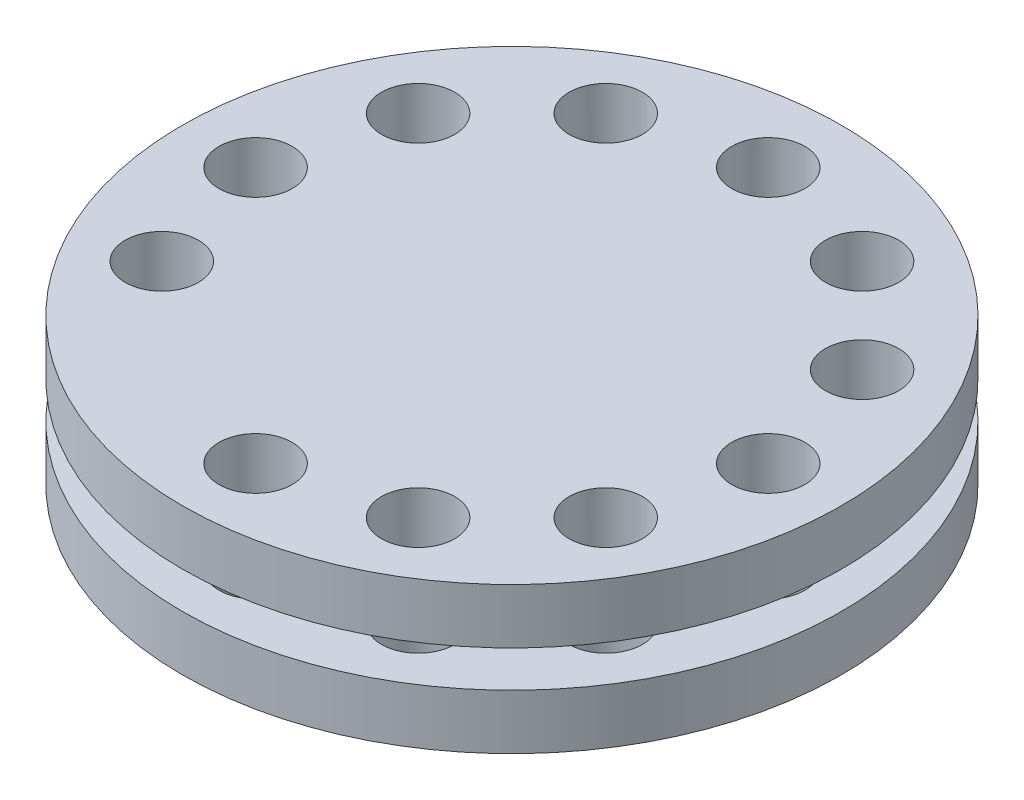
ISO-10303-21;
HEADER;
FILE_DESCRIPTION(('STEP AP214'),'2;1');
FILE_NAME('part.step','',(''),(''),'','','');
FILE_SCHEMA(('AUTOMOTIVE_DESIGN { 1 0 10303 214 1 1 1 1 }'));
ENDSEC;
DATA;
#1=APPLICATION_CONTEXT('core data for automotive mechanical design processes');
#2=APPLICATION_PROTOCOL_DEFINITION('international standard','automotive_design',2000,#1);
#3=PRODUCT_CONTEXT('',#1,'mechanical');
#4=PRODUCT('Part','Part','',(#3));
#5=PRODUCT_RELATED_PRODUCT_CATEGORY('part','',(#4));
#6=PRODUCT_DEFINITION_FORMATION('','',#4);
#7=PRODUCT_DEFINITION_CONTEXT('part definition',#1,'design');
#8=PRODUCT_DEFINITION('design','',#6,#7);
#9=PRODUCT_DEFINITION_SHAPE('','',#8);
#10=(LENGTH_UNIT() NAMED_UNIT(*) SI_UNIT(.MILLI.,.METRE.));
#11=(NAMED_UNIT(*) PLANE_ANGLE_UNIT() SI_UNIT($,.RADIAN.));
#12=(NAMED_UNIT(*) SI_UNIT($,.STERADIAN.) SOLID_ANGLE_UNIT());
#13=UNCERTAINTY_MEASURE_WITH_UNIT(LENGTH_MEASURE(1.E-05),#10,'distance_accuracy_value','');
#14=(GEOMETRIC_REPRESENTATION_CONTEXT(3) GLOBAL_UNCERTAINTY_ASSIGNED_CONTEXT((#13)) GLOBAL_UNIT_ASSIGNED_CONTEXT((#10,
#11,#12)) REPRESENTATION_CONTEXT('',''));
#15=CARTESIAN_POINT('',(0.,0.,0.));
#16=DIRECTION('',(0.,0.,1.));
#17=DIRECTION('',(1.,0.,0.));
#18=AXIS2_PLACEMENT_3D('',#15,#16,#17);
#19=CARTESIAN_POINT('',(0.,1.5,0.));
#20=DIRECTION('',(0.,-1.,0.));
#21=DIRECTION('',(0.,0.,-1.));
#22=AXIS2_PLACEMENT_3D('',#19,#20,#21);
#23=CYLINDRICAL_SURFACE('',#22,9.);
#24=CARTESIAN_POINT('',(0.,1.5,0.));
#25=DIRECTION('',(0.,1.,0.));
#26=DIRECTION('',(0.,0.,1.));
#27=AXIS2_PLACEMENT_3D('',#24,#25,#26);
#28=CIRCLE('',#27,9.);
#29=CARTESIAN_POINT('',(0.,1.5,9.));
#30=VERTEX_POINT('',#29);
#31=EDGE_CURVE('E51',#30,#30,#28,.T.);
#32=ORIENTED_EDGE('',*,*,#31,.F.);
#33=EDGE_LOOP('',(#32));
#34=FACE_BOUND('',#33,.T.);
#35=CARTESIAN_POINT('',(0.,0.,0.));
#36=DIRECTION('',(0.,1.,0.));
#37=DIRECTION('',(0.,0.,1.));
#38=AXIS2_PLACEMENT_3D('',#35,#36,#37);
#39=CIRCLE('',#38,9.);
#40=CARTESIAN_POINT('',(0.,0.,9.));
#41=VERTEX_POINT('',#40);
#42=EDGE_CURVE('E57',#41,#41,#39,.T.);
#43=ORIENTED_EDGE('',*,*,#42,.T.);
#44=EDGE_LOOP('',(#43));
#45=FACE_BOUND('',#44,.T.);
#46=ADVANCED_FACE('F43',(#34,#45),#23,.T.);
#47=CARTESIAN_POINT('',(0.,1.5,0.));
#48=DIRECTION('',(0.,1.,0.));
#49=DIRECTION('',(0.,0.,1.));
#50=AXIS2_PLACEMENT_3D('',#47,#48,#49);
#51=PLANE('',#50);
#52=CARTESIAN_POINT('',(6.06217782649007,1.5,3.49999999999942));
#53=DIRECTION('',(0.,1.,0.));
#54=DIRECTION('',(0.,0.,1.));
#55=AXIS2_PLACEMENT_3D('',#52,#53,#54);
#56=CIRCLE('',#55,1.00000000000101);
#57=CARTESIAN_POINT('',(6.06217782649007,1.5,4.50000000000043));
#58=VERTEX_POINT('',#57);
#59=EDGE_CURVE('E129',#58,#58,#56,.T.);
#60=ORIENTED_EDGE('',*,*,#59,.F.);
#61=EDGE_LOOP('',(#60));
#62=FACE_BOUND('',#61,.T.);
#63=CARTESIAN_POINT('',(6.99999999999884,1.5,0.));
#64=DIRECTION('',(0.,1.,0.));
#65=DIRECTION('',(0.,0.,1.));
#66=AXIS2_PLACEMENT_3D('',#63,#64,#65);
#67=CIRCLE('',#66,1.00000000000102);
#68=CARTESIAN_POINT('',(6.99999999999884,1.5,1.00000000000102));
#69=VERTEX_POINT('',#68);
#70=EDGE_CURVE('E115',#69,#69,#67,.T.);
#71=ORIENTED_EDGE('',*,*,#70,.F.);
#72=EDGE_LOOP('',(#71));
#73=FACE_BOUND('',#72,.T.);
#74=CARTESIAN_POINT('',(6.06217782649007,1.5,-3.49999999999942));
#75=DIRECTION('',(0.,1.,0.));
#76=DIRECTION('',(0.,0.,1.));
#77=AXIS2_PLACEMENT_3D('',#74,#75,#76);
#78=CIRCLE('',#77,1.00000000000102);
#79=CARTESIAN_POINT('',(6.06217782649007,1.5,-2.4999999999984));
#80=VERTEX_POINT('',#79);
#81=EDGE_CURVE('E111',#80,#80,#78,.T.);
#82=ORIENTED_EDGE('',*,*,#81,.F.);
#83=EDGE_LOOP('',(#82));
#84=FACE_BOUND('',#83,.T.);
#85=CARTESIAN_POINT('',(3.49999999999942,1.5,-6.06217782649007));
#86=DIRECTION('',(0.,1.,0.));
#87=DIRECTION('',(0.,0.,1.));
#88=AXIS2_PLACEMENT_3D('',#85,#86,#87);
#89=CIRCLE('',#88,1.00000000000104);
#90=CARTESIAN_POINT('',(3.49999999999942,1.5,-5.06217782648903));
#91=VERTEX_POINT('',#90);
#92=EDGE_CURVE('E107',#91,#91,#89,.T.);
#93=ORIENTED_EDGE('',*,*,#92,.F.);
#94=EDGE_LOOP('',(#93));
#95=FACE_BOUND('',#94,.T.);
#96=CARTESIAN_POINT('',(0.,1.5,-6.99999999999884));
#97=DIRECTION('',(0.,1.,0.));
#98=DIRECTION('',(0.,0.,1.));
#99=AXIS2_PLACEMENT_3D('',#96,#97,#98);
#100=CIRCLE('',#99,1.00000000000104);
#101=CARTESIAN_POINT('',(0.,1.5,-5.9999999999978));
#102=VERTEX_POINT('',#101);
#103=EDGE_CURVE('E102',#102,#102,#100,.T.);
#104=ORIENTED_EDGE('',*,*,#103,.F.);
#105=EDGE_LOOP('',(#104));
#106=FACE_BOUND('',#105,.T.);
#107=CARTESIAN_POINT('',(-3.49999999999942,1.5,-6.06217782649007));
#108=DIRECTION('',(0.,1.,0.));
#109=DIRECTION('',(0.,0.,1.));
#110=AXIS2_PLACEMENT_3D('',#107,#108,#109);
#111=CIRCLE('',#110,1.00000000000105);
#112=CARTESIAN_POINT('',(-3.49999999999942,1.5,-5.06217782648902));
#113=VERTEX_POINT('',#112);
#114=EDGE_CURVE('E97',#113,#113,#111,.T.);
#115=ORIENTED_EDGE('',*,*,#114,.F.);
#116=EDGE_LOOP('',(#115));
#117=FACE_BOUND('',#116,.T.);
#118=CARTESIAN_POINT('',(-6.06217782649007,1.5,-3.49999999999943));
#119=DIRECTION('',(0.,1.,0.));
#120=DIRECTION('',(0.,0.,1.));
#121=AXIS2_PLACEMENT_3D('',#118,#119,#120);
#122=CIRCLE('',#121,1.00000000000106);
#123=CARTESIAN_POINT('',(-6.06217782649007,1.5,-2.49999999999837));
#124=VERTEX_POINT('',#123);
#125=EDGE_CURVE('E92',#124,#124,#122,.T.);
#126=ORIENTED_EDGE('',*,*,#125,.F.);
#127=EDGE_LOOP('',(#126));
#128=FACE_BOUND('',#127,.T.);
#129=CARTESIAN_POINT('',(0.,1.5,6.99999999999884));
#130=DIRECTION('',(0.,1.,0.));
#131=DIRECTION('',(0.,0.,1.));
#132=AXIS2_PLACEMENT_3D('',#129,#130,#131);
#133=CIRCLE('',#132,1.00000000000099);
#134=CARTESIAN_POINT('',(0.,1.5,7.99999999999984));
#135=VERTEX_POINT('',#134);
#136=EDGE_CURVE('E87',#135,#135,#133,.T.);
#137=ORIENTED_EDGE('',*,*,#136,.F.);
#138=EDGE_LOOP('',(#137));
#139=FACE_BOUND('',#138,.T.);
#140=CARTESIAN_POINT('',(-6.99999999999884,1.5,0.));
#141=DIRECTION('',(0.,1.,0.));
#142=DIRECTION('',(0.,0.,1.));
#143=AXIS2_PLACEMENT_3D('',#140,#141,#142);
#144=CIRCLE('',#143,1.00000000000106);
#145=CARTESIAN_POINT('',(-6.99999999999884,1.5,1.00000000000106));
#146=VERTEX_POINT('',#145);
#147=EDGE_CURVE('E82',#146,#146,#144,.T.);
#148=ORIENTED_EDGE('',*,*,#147,.F.);
#149=EDGE_LOOP('',(#148));
#150=FACE_BOUND('',#149,.T.);
#151=CARTESIAN_POINT('',(-6.06217782649007,1.5,3.49999999999942));
#152=DIRECTION('',(0.,1.,0.));
#153=DIRECTION('',(0.,0.,1.));
#154=AXIS2_PLACEMENT_3D('',#151,#152,#153);
#155=CIRCLE('',#154,1.00000000000108);
#156=CARTESIAN_POINT('',(-6.06217782649007,1.5,4.50000000000049));
#157=VERTEX_POINT('',#156);
#158=EDGE_CURVE('E76',#157,#157,#155,.T.);
#159=ORIENTED_EDGE('',*,*,#158,.F.);
#160=EDGE_LOOP('',(#159));
#161=FACE_BOUND('',#160,.T.);
#162=CARTESIAN_POINT('',(-3.49999999999942,1.5,6.06217782649007));
#163=DIRECTION('',(0.,1.,0.));
#164=DIRECTION('',(0.,0.,1.));
#165=AXIS2_PLACEMENT_3D('',#162,#163,#164);
#166=CIRCLE('',#165,1.00000000000108);
#167=CARTESIAN_POINT('',(-3.49999999999942,1.5,7.06217782649115));
#168=VERTEX_POINT('',#167);
#169=EDGE_CURVE('E77',#168,#168,#166,.T.);
#170=ORIENTED_EDGE('',*,*,#169,.F.);
#171=EDGE_LOOP('',(#170));
#172=FACE_BOUND('',#171,.T.);
#173=CARTESIAN_POINT('',(3.49999999999942,1.5,6.06217782649007));
#174=DIRECTION('',(0.,1.,0.));
#175=DIRECTION('',(0.,0.,1.));
#176=AXIS2_PLACEMENT_3D('',#173,#174,#175);
#177=CIRCLE('',#176,1.000000000001);
#178=CARTESIAN_POINT('',(3.49999999999942,1.5,7.06217782649107));
#179=VERTEX_POINT('',#178);
#180=EDGE_CURVE('E70',#179,#179,#177,.T.);
#181=ORIENTED_EDGE('',*,*,#180,.F.);
#182=EDGE_LOOP('',(#181));
#183=FACE_BOUND('',#182,.T.);
#184=CARTESIAN_POINT('',(0.,1.5,0.));
#185=DIRECTION('',(0.,1.,0.));
#186=DIRECTION('',(0.,0.,1.));
#187=AXIS2_PLACEMENT_3D('',#184,#185,#186);
#188=CIRCLE('',#187,5.);
#189=CARTESIAN_POINT('',(0.,1.5,5.));
#190=VERTEX_POINT('',#189);
#191=EDGE_CURVE('E10',#190,#190,#188,.T.);
#192=ORIENTED_EDGE('',*,*,#191,.F.);
#193=EDGE_LOOP('',(#192));
#194=FACE_BOUND('',#193,.T.);
#195=ORIENTED_EDGE('',*,*,#31,.T.);
#196=EDGE_LOOP('',(#195));
#197=FACE_BOUND('',#196,.T.);
#198=ADVANCED_FACE('F163',(#62,#73,#84,#95,#106,#117,#128,#139,#150,#161,#172,#183,#194,#197),
#51,.T.);
#199=CARTESIAN_POINT('',(0.,0.,0.));
#200=DIRECTION('',(0.,1.,0.));
#201=DIRECTION('',(0.,0.,1.));
#202=AXIS2_PLACEMENT_3D('',#199,#200,#201);
#203=PLANE('',#202);
#204=CARTESIAN_POINT('',(6.06217782649007,0.,3.49999999999942));
#205=DIRECTION('',(0.,-1.,0.));
#206=DIRECTION('',(0.,0.,-1.));
#207=AXIS2_PLACEMENT_3D('',#204,#205,#206);
#208=CIRCLE('',#207,1.00000000000101);
#209=CARTESIAN_POINT('',(6.06217782649007,0.,2.49999999999841));
#210=VERTEX_POINT('',#209);
#211=EDGE_CURVE('E446',#210,#210,#208,.T.);
#212=ORIENTED_EDGE('',*,*,#211,.F.);
#213=EDGE_LOOP('',(#212));
#214=FACE_BOUND('',#213,.T.);
#215=CARTESIAN_POINT('',(6.99999999999884,0.,0.));
#216=DIRECTION('',(0.,-1.,0.));
#217=DIRECTION('',(0.,0.,-1.));
#218=AXIS2_PLACEMENT_3D('',#215,#216,#217);
#219=CIRCLE('',#218,1.00000000000102);
#220=CARTESIAN_POINT('',(6.99999999999884,0.,-1.00000000000102));
#221=VERTEX_POINT('',#220);
#222=EDGE_CURVE('E455',#221,#221,#219,.T.);
#223=ORIENTED_EDGE('',*,*,#222,.F.);
#224=EDGE_LOOP('',(#223));
#225=FACE_BOUND('',#224,.T.);
#226=CARTESIAN_POINT('',(6.06217782649007,0.,-3.49999999999942));
#227=DIRECTION('',(0.,-1.,0.));
#228=DIRECTION('',(0.,0.,-1.));
#229=AXIS2_PLACEMENT_3D('',#226,#227,#228);
#230=CIRCLE('',#229,1.00000000000102);
#231=CARTESIAN_POINT('',(6.06217782649007,0.,-4.50000000000045));
#232=VERTEX_POINT('',#231);
#233=EDGE_CURVE('E463',#232,#232,#230,.T.);
#234=ORIENTED_EDGE('',*,*,#233,.F.);
#235=EDGE_LOOP('',(#234));
#236=FACE_BOUND('',#235,.T.);
#237=CARTESIAN_POINT('',(3.49999999999942,0.,-6.06217782649007));
#238=DIRECTION('',(0.,-1.,0.));
#239=DIRECTION('',(0.,0.,-1.));
#240=AXIS2_PLACEMENT_3D('',#237,#238,#239);
#241=CIRCLE('',#240,1.00000000000104);
#242=CARTESIAN_POINT('',(3.49999999999942,0.,-7.06217782649111));
#243=VERTEX_POINT('',#242);
#244=EDGE_CURVE('E471',#243,#243,#241,.T.);
#245=ORIENTED_EDGE('',*,*,#244,.F.);
#246=EDGE_LOOP('',(#245));
#247=FACE_BOUND('',#246,.T.);
#248=CARTESIAN_POINT('',(0.,0.,-6.99999999999884));
#249=DIRECTION('',(0.,-1.,0.));
#250=DIRECTION('',(0.,0.,-1.));
#251=AXIS2_PLACEMENT_3D('',#248,#249,#250);
#252=CIRCLE('',#251,1.00000000000104);
#253=CARTESIAN_POINT('',(0.,0.,-7.99999999999989));
#254=VERTEX_POINT('',#253);
#255=EDGE_CURVE('E479',#254,#254,#252,.T.);
#256=ORIENTED_EDGE('',*,*,#255,.F.);
#257=EDGE_LOOP('',(#256));
#258=FACE_BOUND('',#257,.T.);
#259=CARTESIAN_POINT('',(-3.49999999999942,0.,-6.06217782649007));
#260=DIRECTION('',(0.,-1.,0.));
#261=DIRECTION('',(0.,0.,-1.));
#262=AXIS2_PLACEMENT_3D('',#259,#260,#261);
#263=CIRCLE('',#262,1.00000000000105);
#264=CARTESIAN_POINT('',(-3.49999999999942,0.,-7.06217782649112));
#265=VERTEX_POINT('',#264);
#266=EDGE_CURVE('E487',#265,#265,#263,.T.);
#267=ORIENTED_EDGE('',*,*,#266,.F.);
#268=EDGE_LOOP('',(#267));
#269=FACE_BOUND('',#268,.T.);
#270=CARTESIAN_POINT('',(-6.06217782649007,0.,-3.49999999999943));
#271=DIRECTION('',(0.,-1.,0.));
#272=DIRECTION('',(0.,0.,-1.));
#273=AXIS2_PLACEMENT_3D('',#270,#271,#272);
#274=CIRCLE('',#273,1.00000000000106);
#275=CARTESIAN_POINT('',(-6.06217782649007,0.,-4.50000000000048));
#276=VERTEX_POINT('',#275);
#277=EDGE_CURVE('E495',#276,#276,#274,.T.);
#278=ORIENTED_EDGE('',*,*,#277,.F.);
#279=EDGE_LOOP('',(#278));
#280=FACE_BOUND('',#279,.T.);
#281=CARTESIAN_POINT('',(0.,0.,6.99999999999884));
#282=DIRECTION('',(0.,-1.,0.));
#283=DIRECTION('',(0.,0.,-1.));
#284=AXIS2_PLACEMENT_3D('',#281,#282,#283);
#285=CIRCLE('',#284,1.00000000000099);
#286=CARTESIAN_POINT('',(0.,0.,5.99999999999785));
#287=VERTEX_POINT('',#286);
#288=EDGE_CURVE('E503',#287,#287,#285,.T.);
#289=ORIENTED_EDGE('',*,*,#288,.F.);
#290=EDGE_LOOP('',(#289));
#291=FACE_BOUND('',#290,.T.);
#292=CARTESIAN_POINT('',(-6.99999999999884,0.,0.));
#293=DIRECTION('',(0.,-1.,0.));
#294=DIRECTION('',(0.,0.,-1.));
#295=AXIS2_PLACEMENT_3D('',#292,#293,#294);
#296=CIRCLE('',#295,1.00000000000106);
#297=CARTESIAN_POINT('',(-6.99999999999884,0.,-1.00000000000107));
#298=VERTEX_POINT('',#297);
#299=EDGE_CURVE('E434',#298,#298,#296,.T.);
#300=ORIENTED_EDGE('',*,*,#299,.F.);
#301=EDGE_LOOP('',(#300));
#302=FACE_BOUND('',#301,.T.);
#303=CARTESIAN_POINT('',(-6.06217782649007,0.,3.49999999999942));
#304=DIRECTION('',(0.,-1.,0.));
#305=DIRECTION('',(0.,0.,-1.));
#306=AXIS2_PLACEMENT_3D('',#303,#304,#305);
#307=CIRCLE('',#306,1.00000000000108);
#308=CARTESIAN_POINT('',(-6.06217782649007,0.,2.49999999999834));
#309=VERTEX_POINT('',#308);
#310=EDGE_CURVE('E431',#309,#309,#307,.T.);
#311=ORIENTED_EDGE('',*,*,#310,.F.);
#312=EDGE_LOOP('',(#311));
#313=FACE_BOUND('',#312,.T.);
#314=CARTESIAN_POINT('',(3.49999999999942,0.,6.06217782649007));
#315=DIRECTION('',(0.,-1.,0.));
#316=DIRECTION('',(0.,0.,-1.));
#317=AXIS2_PLACEMENT_3D('',#314,#315,#316);
#318=CIRCLE('',#317,1.000000000001);
#319=CARTESIAN_POINT('',(3.49999999999942,0.,5.06217782648907));
#320=VERTEX_POINT('',#319);
#321=EDGE_CURVE('E450',#320,#320,#318,.T.);
#322=ORIENTED_EDGE('',*,*,#321,.F.);
#323=EDGE_LOOP('',(#322));
#324=FACE_BOUND('',#323,.T.);
#325=ORIENTED_EDGE('',*,*,#42,.F.);
#326=EDGE_LOOP('',(#325));
#327=FACE_BOUND('',#326,.T.);
#328=ADVANCED_FACE('F168',(#214,#225,#236,#247,#258,#269,#280,#291,#302,#313,#324,#327),#203,.F.);
#329=CARTESIAN_POINT('',(0.,2.5,0.));
#330=DIRECTION('',(0.,-1.,0.));
#331=DIRECTION('',(0.,0.,-1.));
#332=AXIS2_PLACEMENT_3D('',#329,#330,#331);
#333=CYLINDRICAL_SURFACE('',#332,5.);
#334=CARTESIAN_POINT('',(0.,2.5,0.));
#335=DIRECTION('',(0.,1.,0.));
#336=DIRECTION('',(0.,0.,1.));
#337=AXIS2_PLACEMENT_3D('',#334,#335,#336);
#338=CIRCLE('',#337,5.);
#339=CARTESIAN_POINT('',(0.,2.5,5.));
#340=VERTEX_POINT('',#339);
#341=EDGE_CURVE('E60',#340,#340,#338,.T.);
#342=ORIENTED_EDGE('',*,*,#341,.F.);
#343=EDGE_LOOP('',(#342));
#344=FACE_BOUND('',#343,.T.);
#345=ORIENTED_EDGE('',*,*,#191,.T.);
#346=EDGE_LOOP('',(#345));
#347=FACE_BOUND('',#346,.T.);
#348=ADVANCED_FACE('F176',(#344,#347),#333,.T.);
#349=CARTESIAN_POINT('',(0.,4.,0.));
#350=DIRECTION('',(0.,-1.,0.));
#351=DIRECTION('',(0.,0.,-1.));
#352=AXIS2_PLACEMENT_3D('',#349,#350,#351);
#353=CYLINDRICAL_SURFACE('',#352,9.);
#354=CARTESIAN_POINT('',(0.,4.,0.));
#355=DIRECTION('',(0.,1.,0.));
#356=DIRECTION('',(0.,0.,1.));
#357=AXIS2_PLACEMENT_3D('',#354,#355,#356);
#358=CIRCLE('',#357,9.);
#359=CARTESIAN_POINT('',(0.,4.,9.));
#360=VERTEX_POINT('',#359);
#361=EDGE_CURVE('E134',#360,#360,#358,.T.);
#362=ORIENTED_EDGE('',*,*,#361,.F.);
#363=EDGE_LOOP('',(#362));
#364=FACE_BOUND('',#363,.T.);
#365=CARTESIAN_POINT('',(0.,2.5,0.));
#366=DIRECTION('',(0.,1.,0.));
#367=DIRECTION('',(0.,0.,1.));
#368=AXIS2_PLACEMENT_3D('',#365,#366,#367);
#369=CIRCLE('',#368,9.);
#370=CARTESIAN_POINT('',(0.,2.5,9.));
#371=VERTEX_POINT('',#370);
#372=EDGE_CURVE('E133',#371,#371,#369,.T.);
#373=ORIENTED_EDGE('',*,*,#372,.T.);
#374=EDGE_LOOP('',(#373));
#375=FACE_BOUND('',#374,.T.);
#376=ADVANCED_FACE('F141',(#364,#375),#353,.T.);
#377=CARTESIAN_POINT('',(0.,4.,0.));
#378=DIRECTION('',(0.,1.,0.));
#379=DIRECTION('',(0.,0.,1.));
#380=AXIS2_PLACEMENT_3D('',#377,#378,#379);
#381=PLANE('',#380);
#382=CARTESIAN_POINT('',(6.06217782649007,4.,3.49999999999942));
#383=DIRECTION('',(0.,-1.,0.));
#384=DIRECTION('',(0.,0.,-1.));
#385=AXIS2_PLACEMENT_3D('',#382,#383,#384);
#386=CIRCLE('',#385,1.00000000000101);
#387=CARTESIAN_POINT('',(6.06217782649007,4.,2.49999999999841));
#388=VERTEX_POINT('',#387);
#389=EDGE_CURVE('E451',#388,#388,#386,.T.);
#390=ORIENTED_EDGE('',*,*,#389,.T.);
#391=EDGE_LOOP('',(#390));
#392=FACE_BOUND('',#391,.T.);
#393=CARTESIAN_POINT('',(6.99999999999884,4.,0.));
#394=DIRECTION('',(0.,-1.,0.));
#395=DIRECTION('',(0.,0.,-1.));
#396=AXIS2_PLACEMENT_3D('',#393,#394,#395);
#397=CIRCLE('',#396,1.00000000000102);
#398=CARTESIAN_POINT('',(6.99999999999884,4.,-1.00000000000102));
#399=VERTEX_POINT('',#398);
#400=EDGE_CURVE('E459',#399,#399,#397,.T.);
#401=ORIENTED_EDGE('',*,*,#400,.T.);
#402=EDGE_LOOP('',(#401));
#403=FACE_BOUND('',#402,.T.);
#404=CARTESIAN_POINT('',(6.06217782649007,4.,-3.49999999999942));
#405=DIRECTION('',(0.,-1.,0.));
#406=DIRECTION('',(0.,0.,-1.));
#407=AXIS2_PLACEMENT_3D('',#404,#405,#406);
#408=CIRCLE('',#407,1.00000000000102);
#409=CARTESIAN_POINT('',(6.06217782649007,4.,-4.50000000000045));
#410=VERTEX_POINT('',#409);
#411=EDGE_CURVE('E467',#410,#410,#408,.T.);
#412=ORIENTED_EDGE('',*,*,#411,.T.);
#413=EDGE_LOOP('',(#412));
#414=FACE_BOUND('',#413,.T.);
#415=CARTESIAN_POINT('',(3.49999999999942,4.,-6.06217782649007));
#416=DIRECTION('',(0.,-1.,0.));
#417=DIRECTION('',(0.,0.,-1.));
#418=AXIS2_PLACEMENT_3D('',#415,#416,#417);
#419=CIRCLE('',#418,1.00000000000104);
#420=CARTESIAN_POINT('',(3.49999999999942,4.,-7.06217782649111));
#421=VERTEX_POINT('',#420);
#422=EDGE_CURVE('E475',#421,#421,#419,.T.);
#423=ORIENTED_EDGE('',*,*,#422,.T.);
#424=EDGE_LOOP('',(#423));
#425=FACE_BOUND('',#424,.T.);
#426=CARTESIAN_POINT('',(0.,4.,-6.99999999999884));
#427=DIRECTION('',(0.,-1.,0.));
#428=DIRECTION('',(0.,0.,-1.));
#429=AXIS2_PLACEMENT_3D('',#426,#427,#428);
#430=CIRCLE('',#429,1.00000000000104);
#431=CARTESIAN_POINT('',(0.,4.,-7.99999999999989));
#432=VERTEX_POINT('',#431);
#433=EDGE_CURVE('E483',#432,#432,#430,.T.);
#434=ORIENTED_EDGE('',*,*,#433,.T.);
#435=EDGE_LOOP('',(#434));
#436=FACE_BOUND('',#435,.T.);
#437=CARTESIAN_POINT('',(-3.49999999999942,4.,-6.06217782649007));
#438=DIRECTION('',(0.,-1.,0.));
#439=DIRECTION('',(0.,0.,-1.));
#440=AXIS2_PLACEMENT_3D('',#437,#438,#439);
#441=CIRCLE('',#440,1.00000000000105);
#442=CARTESIAN_POINT('',(-3.49999999999942,4.,-7.06217782649112));
#443=VERTEX_POINT('',#442);
#444=EDGE_CURVE('E491',#443,#443,#441,.T.);
#445=ORIENTED_EDGE('',*,*,#444,.T.);
#446=EDGE_LOOP('',(#445));
#447=FACE_BOUND('',#446,.T.);
#448=CARTESIAN_POINT('',(-6.06217782649007,4.,-3.49999999999943));
#449=DIRECTION('',(0.,-1.,0.));
#450=DIRECTION('',(0.,0.,-1.));
#451=AXIS2_PLACEMENT_3D('',#448,#449,#450);
#452=CIRCLE('',#451,1.00000000000106);
#453=CARTESIAN_POINT('',(-6.06217782649007,4.,-4.50000000000048));
#454=VERTEX_POINT('',#453);
#455=EDGE_CURVE('E499',#454,#454,#452,.T.);
#456=ORIENTED_EDGE('',*,*,#455,.T.);
#457=EDGE_LOOP('',(#456));
#458=FACE_BOUND('',#457,.T.);
#459=CARTESIAN_POINT('',(0.,4.,6.99999999999884));
#460=DIRECTION('',(0.,-1.,0.));
#461=DIRECTION('',(0.,0.,-1.));
#462=AXIS2_PLACEMENT_3D('',#459,#460,#461);
#463=CIRCLE('',#462,1.00000000000099);
#464=CARTESIAN_POINT('',(0.,4.,5.99999999999785));
#465=VERTEX_POINT('',#464);
#466=EDGE_CURVE('E438',#465,#465,#463,.T.);
#467=ORIENTED_EDGE('',*,*,#466,.T.);
#468=EDGE_LOOP('',(#467));
#469=FACE_BOUND('',#468,.T.);
#470=CARTESIAN_POINT('',(-6.99999999999884,4.,0.));
#471=DIRECTION('',(0.,-1.,0.));
#472=DIRECTION('',(0.,0.,-1.));
#473=AXIS2_PLACEMENT_3D('',#470,#471,#472);
#474=CIRCLE('',#473,1.00000000000106);
#475=CARTESIAN_POINT('',(-6.99999999999884,4.,-1.00000000000107));
#476=VERTEX_POINT('',#475);
#477=EDGE_CURVE('E439',#476,#476,#474,.T.);
#478=ORIENTED_EDGE('',*,*,#477,.T.);
#479=EDGE_LOOP('',(#478));
#480=FACE_BOUND('',#479,.T.);
#481=CARTESIAN_POINT('',(-6.06217782649007,4.,3.49999999999942));
#482=DIRECTION('',(0.,-1.,0.));
#483=DIRECTION('',(0.,0.,-1.));
#484=AXIS2_PLACEMENT_3D('',#481,#482,#483);
#485=CIRCLE('',#484,1.00000000000108);
#486=CARTESIAN_POINT('',(-6.06217782649007,4.,2.49999999999834));
#487=VERTEX_POINT('',#486);
#488=EDGE_CURVE('E427',#487,#487,#485,.T.);
#489=ORIENTED_EDGE('',*,*,#488,.T.);
#490=EDGE_LOOP('',(#489));
#491=FACE_BOUND('',#490,.T.);
#492=CARTESIAN_POINT('',(3.49999999999942,4.,6.06217782649007));
#493=DIRECTION('',(0.,-1.,0.));
#494=DIRECTION('',(0.,0.,-1.));
#495=AXIS2_PLACEMENT_3D('',#492,#493,#494);
#496=CIRCLE('',#495,1.000000000001);
#497=CARTESIAN_POINT('',(3.49999999999942,4.,5.06217782648907));
#498=VERTEX_POINT('',#497);
#499=EDGE_CURVE('E71',#498,#498,#496,.T.);
#500=ORIENTED_EDGE('',*,*,#499,.T.);
#501=EDGE_LOOP('',(#500));
#502=FACE_BOUND('',#501,.T.);
#503=ORIENTED_EDGE('',*,*,#361,.T.);
#504=EDGE_LOOP('',(#503));
#505=FACE_BOUND('',#504,.T.);
#506=ADVANCED_FACE('F146',(#392,#403,#414,#425,#436,#447,#458,#469,#480,#491,#502,#505),#381,.T.);
#507=CARTESIAN_POINT('',(0.,2.5,0.));
#508=DIRECTION('',(0.,1.,0.));
#509=DIRECTION('',(0.,0.,1.));
#510=AXIS2_PLACEMENT_3D('',#507,#508,#509);
#511=PLANE('',#510);
#512=CARTESIAN_POINT('',(6.06217782649007,2.5,3.49999999999942));
#513=DIRECTION('',(0.,1.,0.));
#514=DIRECTION('',(0.,0.,1.));
#515=AXIS2_PLACEMENT_3D('',#512,#513,#514);
#516=CIRCLE('',#515,1.00000000000101);
#517=CARTESIAN_POINT('',(6.06217782649007,2.5,4.50000000000043));
#518=VERTEX_POINT('',#517);
#519=EDGE_CURVE('E46',#518,#518,#516,.T.);
#520=ORIENTED_EDGE('',*,*,#519,.T.);
#521=EDGE_LOOP('',(#520));
#522=FACE_BOUND('',#521,.T.);
#523=CARTESIAN_POINT('',(6.99999999999884,2.5,0.));
#524=DIRECTION('',(0.,1.,0.));
#525=DIRECTION('',(0.,0.,1.));
#526=AXIS2_PLACEMENT_3D('',#523,#524,#525);
#527=CIRCLE('',#526,1.00000000000102);
#528=CARTESIAN_POINT('',(6.99999999999884,2.5,1.00000000000102));
#529=VERTEX_POINT('',#528);
#530=EDGE_CURVE('E112',#529,#529,#527,.T.);
#531=ORIENTED_EDGE('',*,*,#530,.T.);
#532=EDGE_LOOP('',(#531));
#533=FACE_BOUND('',#532,.T.);
#534=CARTESIAN_POINT('',(6.06217782649007,2.5,-3.49999999999942));
#535=DIRECTION('',(0.,1.,0.));
#536=DIRECTION('',(0.,0.,1.));
#537=AXIS2_PLACEMENT_3D('',#534,#535,#536);
#538=CIRCLE('',#537,1.00000000000102);
#539=CARTESIAN_POINT('',(6.06217782649007,2.5,-2.4999999999984));
#540=VERTEX_POINT('',#539);
#541=EDGE_CURVE('E108',#540,#540,#538,.T.);
#542=ORIENTED_EDGE('',*,*,#541,.T.);
#543=EDGE_LOOP('',(#542));
#544=FACE_BOUND('',#543,.T.);
#545=CARTESIAN_POINT('',(3.49999999999942,2.5,-6.06217782649007));
#546=DIRECTION('',(0.,1.,0.));
#547=DIRECTION('',(0.,0.,1.));
#548=AXIS2_PLACEMENT_3D('',#545,#546,#547);
#549=CIRCLE('',#548,1.00000000000104);
#550=CARTESIAN_POINT('',(3.49999999999942,2.5,-5.06217782648903));
#551=VERTEX_POINT('',#550);
#552=EDGE_CURVE('E103',#551,#551,#549,.T.);
#553=ORIENTED_EDGE('',*,*,#552,.T.);
#554=EDGE_LOOP('',(#553));
#555=FACE_BOUND('',#554,.T.);
#556=CARTESIAN_POINT('',(0.,2.5,-6.99999999999884));
#557=DIRECTION('',(0.,1.,0.));
#558=DIRECTION('',(0.,0.,1.));
#559=AXIS2_PLACEMENT_3D('',#556,#557,#558);
#560=CIRCLE('',#559,1.00000000000104);
#561=CARTESIAN_POINT('',(0.,2.5,-5.9999999999978));
#562=VERTEX_POINT('',#561);
#563=EDGE_CURVE('E98',#562,#562,#560,.T.);
#564=ORIENTED_EDGE('',*,*,#563,.T.);
#565=EDGE_LOOP('',(#564));
#566=FACE_BOUND('',#565,.T.);
#567=CARTESIAN_POINT('',(-3.49999999999942,2.5,-6.06217782649007));
#568=DIRECTION('',(0.,1.,0.));
#569=DIRECTION('',(0.,0.,1.));
#570=AXIS2_PLACEMENT_3D('',#567,#568,#569);
#571=CIRCLE('',#570,1.00000000000105);
#572=CARTESIAN_POINT('',(-3.49999999999942,2.5,-5.06217782648902));
#573=VERTEX_POINT('',#572);
#574=EDGE_CURVE('E93',#573,#573,#571,.T.);
#575=ORIENTED_EDGE('',*,*,#574,.T.);
#576=EDGE_LOOP('',(#575));
#577=FACE_BOUND('',#576,.T.);
#578=CARTESIAN_POINT('',(-6.06217782649007,2.5,-3.49999999999943));
#579=DIRECTION('',(0.,1.,0.));
#580=DIRECTION('',(0.,0.,1.));
#581=AXIS2_PLACEMENT_3D('',#578,#579,#580);
#582=CIRCLE('',#581,1.00000000000106);
#583=CARTESIAN_POINT('',(-6.06217782649007,2.5,-2.49999999999837));
#584=VERTEX_POINT('',#583);
#585=EDGE_CURVE('E88',#584,#584,#582,.T.);
#586=ORIENTED_EDGE('',*,*,#585,.T.);
#587=EDGE_LOOP('',(#586));
#588=FACE_BOUND('',#587,.T.);
#589=CARTESIAN_POINT('',(0.,2.5,6.99999999999884));
#590=DIRECTION('',(0.,1.,0.));
#591=DIRECTION('',(0.,0.,1.));
#592=AXIS2_PLACEMENT_3D('',#589,#590,#591);
#593=CIRCLE('',#592,1.00000000000099);
#594=CARTESIAN_POINT('',(0.,2.5,7.99999999999984));
#595=VERTEX_POINT('',#594);
#596=EDGE_CURVE('E83',#595,#595,#593,.T.);
#597=ORIENTED_EDGE('',*,*,#596,.T.);
#598=EDGE_LOOP('',(#597));
#599=FACE_BOUND('',#598,.T.);
#600=CARTESIAN_POINT('',(-6.99999999999884,2.5,0.));
#601=DIRECTION('',(0.,1.,0.));
#602=DIRECTION('',(0.,0.,1.));
#603=AXIS2_PLACEMENT_3D('',#600,#601,#602);
#604=CIRCLE('',#603,1.00000000000106);
#605=CARTESIAN_POINT('',(-6.99999999999884,2.5,1.00000000000106));
#606=VERTEX_POINT('',#605);
#607=EDGE_CURVE('E78',#606,#606,#604,.T.);
#608=ORIENTED_EDGE('',*,*,#607,.T.);
#609=EDGE_LOOP('',(#608));
#610=FACE_BOUND('',#609,.T.);
#611=CARTESIAN_POINT('',(-6.06217782649007,2.5,3.49999999999942));
#612=DIRECTION('',(0.,1.,0.));
#613=DIRECTION('',(0.,0.,1.));
#614=AXIS2_PLACEMENT_3D('',#611,#612,#613);
#615=CIRCLE('',#614,1.00000000000108);
#616=CARTESIAN_POINT('',(-6.06217782649007,2.5,4.50000000000049));
#617=VERTEX_POINT('',#616);
#618=EDGE_CURVE('E72',#617,#617,#615,.T.);
#619=ORIENTED_EDGE('',*,*,#618,.T.);
#620=EDGE_LOOP('',(#619));
#621=FACE_BOUND('',#620,.T.);
#622=CARTESIAN_POINT('',(-3.49999999999942,2.5,6.06217782649007));
#623=DIRECTION('',(0.,1.,0.));
#624=DIRECTION('',(0.,0.,1.));
#625=AXIS2_PLACEMENT_3D('',#622,#623,#624);
#626=CIRCLE('',#625,1.00000000000108);
#627=CARTESIAN_POINT('',(-3.49999999999942,2.5,7.06217782649115));
#628=VERTEX_POINT('',#627);
#629=EDGE_CURVE('E424',#628,#628,#626,.T.);
#630=ORIENTED_EDGE('',*,*,#629,.T.);
#631=EDGE_LOOP('',(#630));
#632=FACE_BOUND('',#631,.T.);
#633=CARTESIAN_POINT('',(3.49999999999942,2.5,6.06217782649007));
#634=DIRECTION('',(0.,1.,0.));
#635=DIRECTION('',(0.,0.,1.));
#636=AXIS2_PLACEMENT_3D('',#633,#634,#635);
#637=CIRCLE('',#636,1.000000000001);
#638=CARTESIAN_POINT('',(3.49999999999942,2.5,7.06217782649107));
#639=VERTEX_POINT('',#638);
#640=EDGE_CURVE('E66',#639,#639,#637,.T.);
#641=ORIENTED_EDGE('',*,*,#640,.T.);
#642=EDGE_LOOP('',(#641));
#643=FACE_BOUND('',#642,.T.);
#644=ORIENTED_EDGE('',*,*,#341,.T.);
#645=EDGE_LOOP('',(#644));
#646=FACE_BOUND('',#645,.T.);
#647=ORIENTED_EDGE('',*,*,#372,.F.);
#648=EDGE_LOOP('',(#647));
#649=FACE_BOUND('',#648,.T.);
#650=ADVANCED_FACE('F143',(#522,#533,#544,#555,#566,#577,#588,#599,#610,#621,#632,#643,#646,
#649),#511,.F.);
#651=CARTESIAN_POINT('',(3.49999999999942,4.,6.06217782649007));
#652=DIRECTION('',(0.,-1.,0.));
#653=DIRECTION('',(0.,0.,-1.));
#654=AXIS2_PLACEMENT_3D('',#651,#652,#653);
#655=CYLINDRICAL_SURFACE('',#654,1.000000000001);
#656=ORIENTED_EDGE('',*,*,#499,.F.);
#657=EDGE_LOOP('',(#656));
#658=FACE_BOUND('',#657,.T.);
#659=ORIENTED_EDGE('',*,*,#640,.F.);
#660=EDGE_LOOP('',(#659));
#661=FACE_BOUND('',#660,.T.);
#662=ADVANCED_FACE('F145',(#658,#661),#655,.F.);
#663=CARTESIAN_POINT('',(-6.06217782649007,4.,3.49999999999942));
#664=DIRECTION('',(0.,-1.,0.));
#665=DIRECTION('',(0.,0.,-1.));
#666=AXIS2_PLACEMENT_3D('',#663,#664,#665);
#667=CYLINDRICAL_SURFACE('',#666,1.00000000000108);
#668=ORIENTED_EDGE('',*,*,#488,.F.);
#669=EDGE_LOOP('',(#668));
#670=FACE_BOUND('',#669,.T.);
#671=ORIENTED_EDGE('',*,*,#618,.F.);
#672=EDGE_LOOP('',(#671));
#673=FACE_BOUND('',#672,.T.);
#674=ADVANCED_FACE('F153',(#670,#673),#667,.F.);
#675=CARTESIAN_POINT('',(-6.99999999999884,4.,0.));
#676=DIRECTION('',(0.,-1.,0.));
#677=DIRECTION('',(0.,0.,-1.));
#678=AXIS2_PLACEMENT_3D('',#675,#676,#677);
#679=CYLINDRICAL_SURFACE('',#678,1.00000000000106);
#680=ORIENTED_EDGE('',*,*,#477,.F.);
#681=EDGE_LOOP('',(#680));
#682=FACE_BOUND('',#681,.T.);
#683=ORIENTED_EDGE('',*,*,#607,.F.);
#684=EDGE_LOOP('',(#683));
#685=FACE_BOUND('',#684,.T.);
#686=ADVANCED_FACE('F238',(#682,#685),#679,.F.);
#687=CARTESIAN_POINT('',(0.,4.,6.99999999999884));
#688=DIRECTION('',(0.,-1.,0.));
#689=DIRECTION('',(0.,0.,-1.));
#690=AXIS2_PLACEMENT_3D('',#687,#688,#689);
#691=CYLINDRICAL_SURFACE('',#690,1.00000000000099);
#692=ORIENTED_EDGE('',*,*,#466,.F.);
#693=EDGE_LOOP('',(#692));
#694=FACE_BOUND('',#693,.T.);
#695=ORIENTED_EDGE('',*,*,#596,.F.);
#696=EDGE_LOOP('',(#695));
#697=FACE_BOUND('',#696,.T.);
#698=ADVANCED_FACE('F248',(#694,#697),#691,.F.);
#699=CARTESIAN_POINT('',(-6.06217782649007,4.,-3.49999999999943));
#700=DIRECTION('',(0.,-1.,0.));
#701=DIRECTION('',(0.,0.,-1.));
#702=AXIS2_PLACEMENT_3D('',#699,#700,#701);
#703=CYLINDRICAL_SURFACE('',#702,1.00000000000106);
#704=ORIENTED_EDGE('',*,*,#455,.F.);
#705=EDGE_LOOP('',(#704));
#706=FACE_BOUND('',#705,.T.);
#707=ORIENTED_EDGE('',*,*,#585,.F.);
#708=EDGE_LOOP('',(#707));
#709=FACE_BOUND('',#708,.T.);
#710=ADVANCED_FACE('F258',(#706,#709),#703,.F.);
#711=CARTESIAN_POINT('',(-3.49999999999942,4.,-6.06217782649007));
#712=DIRECTION('',(0.,-1.,0.));
#713=DIRECTION('',(0.,0.,-1.));
#714=AXIS2_PLACEMENT_3D('',#711,#712,#713);
#715=CYLINDRICAL_SURFACE('',#714,1.00000000000105);
#716=ORIENTED_EDGE('',*,*,#444,.F.);
#717=EDGE_LOOP('',(#716));
#718=FACE_BOUND('',#717,.T.);
#719=ORIENTED_EDGE('',*,*,#574,.F.);
#720=EDGE_LOOP('',(#719));
#721=FACE_BOUND('',#720,.T.);
#722=ADVANCED_FACE('F268',(#718,#721),#715,.F.);
#723=CARTESIAN_POINT('',(0.,4.,-6.99999999999884));
#724=DIRECTION('',(0.,-1.,0.));
#725=DIRECTION('',(0.,0.,-1.));
#726=AXIS2_PLACEMENT_3D('',#723,#724,#725);
#727=CYLINDRICAL_SURFACE('',#726,1.00000000000104);
#728=ORIENTED_EDGE('',*,*,#433,.F.);
#729=EDGE_LOOP('',(#728));
#730=FACE_BOUND('',#729,.T.);
#731=ORIENTED_EDGE('',*,*,#563,.F.);
#732=EDGE_LOOP('',(#731));
#733=FACE_BOUND('',#732,.T.);
#734=ADVANCED_FACE('F278',(#730,#733),#727,.F.);
#735=CARTESIAN_POINT('',(3.49999999999942,4.,-6.06217782649007));
#736=DIRECTION('',(0.,-1.,0.));
#737=DIRECTION('',(0.,0.,-1.));
#738=AXIS2_PLACEMENT_3D('',#735,#736,#737);
#739=CYLINDRICAL_SURFACE('',#738,1.00000000000104);
#740=ORIENTED_EDGE('',*,*,#422,.F.);
#741=EDGE_LOOP('',(#740));
#742=FACE_BOUND('',#741,.T.);
#743=ORIENTED_EDGE('',*,*,#552,.F.);
#744=EDGE_LOOP('',(#743));
#745=FACE_BOUND('',#744,.T.);
#746=ADVANCED_FACE('F288',(#742,#745),#739,.F.);
#747=CARTESIAN_POINT('',(6.06217782649007,4.,-3.49999999999942));
#748=DIRECTION('',(0.,-1.,0.));
#749=DIRECTION('',(0.,0.,-1.));
#750=AXIS2_PLACEMENT_3D('',#747,#748,#749);
#751=CYLINDRICAL_SURFACE('',#750,1.00000000000102);
#752=ORIENTED_EDGE('',*,*,#411,.F.);
#753=EDGE_LOOP('',(#752));
#754=FACE_BOUND('',#753,.T.);
#755=ORIENTED_EDGE('',*,*,#541,.F.);
#756=EDGE_LOOP('',(#755));
#757=FACE_BOUND('',#756,.T.);
#758=ADVANCED_FACE('F298',(#754,#757),#751,.F.);
#759=CARTESIAN_POINT('',(6.99999999999884,4.,0.));
#760=DIRECTION('',(0.,-1.,0.));
#761=DIRECTION('',(0.,0.,-1.));
#762=AXIS2_PLACEMENT_3D('',#759,#760,#761);
#763=CYLINDRICAL_SURFACE('',#762,1.00000000000102);
#764=ORIENTED_EDGE('',*,*,#400,.F.);
#765=EDGE_LOOP('',(#764));
#766=FACE_BOUND('',#765,.T.);
#767=ORIENTED_EDGE('',*,*,#530,.F.);
#768=EDGE_LOOP('',(#767));
#769=FACE_BOUND('',#768,.T.);
#770=ADVANCED_FACE('F308',(#766,#769),#763,.F.);
#771=CARTESIAN_POINT('',(6.06217782649007,4.,3.49999999999942));
#772=DIRECTION('',(0.,-1.,0.));
#773=DIRECTION('',(0.,0.,-1.));
#774=AXIS2_PLACEMENT_3D('',#771,#772,#773);
#775=CYLINDRICAL_SURFACE('',#774,1.00000000000101);
#776=ORIENTED_EDGE('',*,*,#389,.F.);
#777=EDGE_LOOP('',(#776));
#778=FACE_BOUND('',#777,.T.);
#779=ORIENTED_EDGE('',*,*,#519,.F.);
#780=EDGE_LOOP('',(#779));
#781=FACE_BOUND('',#780,.T.);
#782=ADVANCED_FACE('F318',(#778,#781),#775,.F.);
#783=ORIENTED_EDGE('',*,*,#180,.T.);
#784=EDGE_LOOP('',(#783));
#785=FACE_BOUND('',#784,.T.);
#786=ORIENTED_EDGE('',*,*,#321,.T.);
#787=EDGE_LOOP('',(#786));
#788=FACE_BOUND('',#787,.T.);
#789=ADVANCED_FACE('F156',(#785,#788),#655,.F.);
#790=ORIENTED_EDGE('',*,*,#158,.T.);
#791=EDGE_LOOP('',(#790));
#792=FACE_BOUND('',#791,.T.);
#793=ORIENTED_EDGE('',*,*,#310,.T.);
#794=EDGE_LOOP('',(#793));
#795=FACE_BOUND('',#794,.T.);
#796=ADVANCED_FACE('F241',(#792,#795),#667,.F.);
#797=ORIENTED_EDGE('',*,*,#147,.T.);
#798=EDGE_LOOP('',(#797));
#799=FACE_BOUND('',#798,.T.);
#800=ORIENTED_EDGE('',*,*,#299,.T.);
#801=EDGE_LOOP('',(#800));
#802=FACE_BOUND('',#801,.T.);
#803=ADVANCED_FACE('F251',(#799,#802),#679,.F.);
#804=ORIENTED_EDGE('',*,*,#136,.T.);
#805=EDGE_LOOP('',(#804));
#806=FACE_BOUND('',#805,.T.);
#807=ORIENTED_EDGE('',*,*,#288,.T.);
#808=EDGE_LOOP('',(#807));
#809=FACE_BOUND('',#808,.T.);
#810=ADVANCED_FACE('F261',(#806,#809),#691,.F.);
#811=ORIENTED_EDGE('',*,*,#125,.T.);
#812=EDGE_LOOP('',(#811));
#813=FACE_BOUND('',#812,.T.);
#814=ORIENTED_EDGE('',*,*,#277,.T.);
#815=EDGE_LOOP('',(#814));
#816=FACE_BOUND('',#815,.T.);
#817=ADVANCED_FACE('F271',(#813,#816),#703,.F.);
#818=ORIENTED_EDGE('',*,*,#114,.T.);
#819=EDGE_LOOP('',(#818));
#820=FACE_BOUND('',#819,.T.);
#821=ORIENTED_EDGE('',*,*,#266,.T.);
#822=EDGE_LOOP('',(#821));
#823=FACE_BOUND('',#822,.T.);
#824=ADVANCED_FACE('F281',(#820,#823),#715,.F.);
#825=ORIENTED_EDGE('',*,*,#103,.T.);
#826=EDGE_LOOP('',(#825));
#827=FACE_BOUND('',#826,.T.);
#828=ORIENTED_EDGE('',*,*,#255,.T.);
#829=EDGE_LOOP('',(#828));
#830=FACE_BOUND('',#829,.T.);
#831=ADVANCED_FACE('F291',(#827,#830),#727,.F.);
#832=ORIENTED_EDGE('',*,*,#92,.T.);
#833=EDGE_LOOP('',(#832));
#834=FACE_BOUND('',#833,.T.);
#835=ORIENTED_EDGE('',*,*,#244,.T.);
#836=EDGE_LOOP('',(#835));
#837=FACE_BOUND('',#836,.T.);
#838=ADVANCED_FACE('F301',(#834,#837),#739,.F.);
#839=ORIENTED_EDGE('',*,*,#81,.T.);
#840=EDGE_LOOP('',(#839));
#841=FACE_BOUND('',#840,.T.);
#842=ORIENTED_EDGE('',*,*,#233,.T.);
#843=EDGE_LOOP('',(#842));
#844=FACE_BOUND('',#843,.T.);
#845=ADVANCED_FACE('F311',(#841,#844),#751,.F.);
#846=ORIENTED_EDGE('',*,*,#70,.T.);
#847=EDGE_LOOP('',(#846));
#848=FACE_BOUND('',#847,.T.);
#849=ORIENTED_EDGE('',*,*,#222,.T.);
#850=EDGE_LOOP('',(#849));
#851=FACE_BOUND('',#850,.T.);
#852=ADVANCED_FACE('F321',(#848,#851),#763,.F.);
#853=ORIENTED_EDGE('',*,*,#59,.T.);
#854=EDGE_LOOP('',(#853));
#855=FACE_BOUND('',#854,.T.);
#856=ORIENTED_EDGE('',*,*,#211,.T.);
#857=EDGE_LOOP('',(#856));
#858=FACE_BOUND('',#857,.T.);
#859=ADVANCED_FACE('F330',(#855,#858),#775,.F.);
#860=CARTESIAN_POINT('',(-3.49999999999942,-2.82842712474924,6.06217782649007));
#861=DIRECTION('',(0.,1.,0.));
#862=DIRECTION('',(0.,0.,1.));
#863=AXIS2_PLACEMENT_3D('',#860,#861,#862);
#864=CYLINDRICAL_SURFACE('',#863,1.00000000000108);
#865=ORIENTED_EDGE('',*,*,#169,.T.);
#866=EDGE_LOOP('',(#865));
#867=FACE_BOUND('',#866,.T.);
#868=ORIENTED_EDGE('',*,*,#629,.F.);
#869=EDGE_LOOP('',(#868));
#870=FACE_BOUND('',#869,.T.);
#871=ADVANCED_FACE('F404',(#867,#870),#864,.T.);
#872=CLOSED_SHELL('',(#46,#198,#328,#348,#376,#506,#650,#662,#674,#686,#698,#710,#722,#734,#746,
#758,#770,#782,#789,#796,#803,#810,#817,#824,#831,#838,#845,#852,#859,#871));
#873=MANIFOLD_SOLID_BREP('B2',#872);
#874=ADVANCED_BREP_SHAPE_REPRESENTATION('',(#18,#873),#14);
#875=SHAPE_DEFINITION_REPRESENTATION(#9,#874);
ENDSEC;
END-ISO-10303-21;
